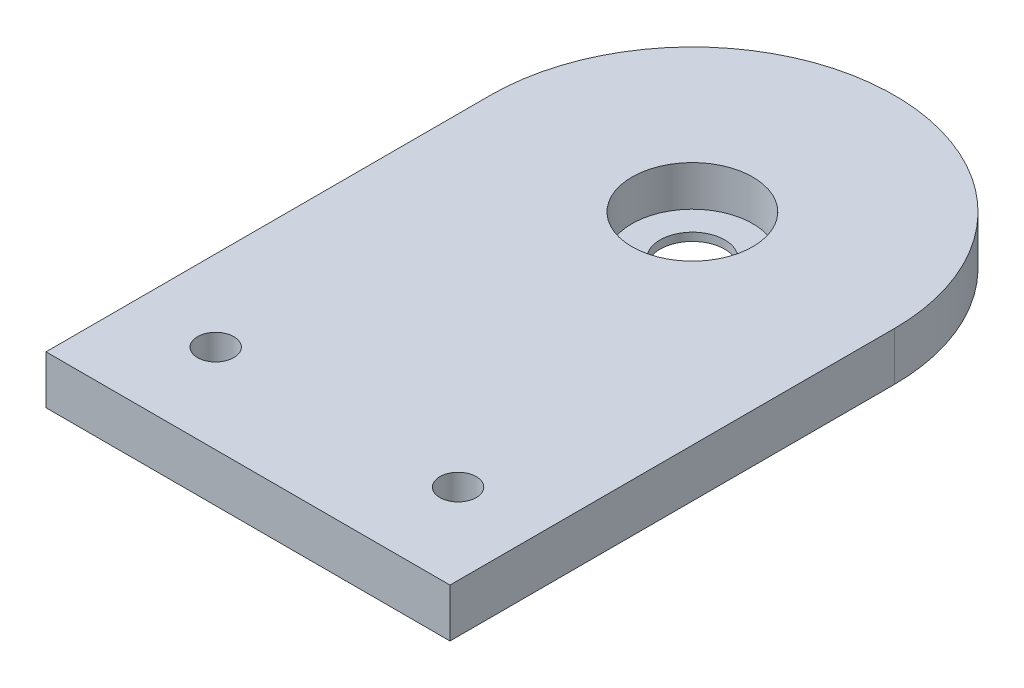
ISO-10303-21;
HEADER;
FILE_DESCRIPTION(('STEP AP214'),'2;1');
FILE_NAME('part.step','',(''),(''),'','','');
FILE_SCHEMA(('AUTOMOTIVE_DESIGN { 1 0 10303 214 1 1 1 1 }'));
ENDSEC;
DATA;
#1=APPLICATION_CONTEXT('core data for automotive mechanical design processes');
#2=APPLICATION_PROTOCOL_DEFINITION('international standard','automotive_design',2000,#1);
#3=PRODUCT_CONTEXT('',#1,'mechanical');
#4=PRODUCT('Part','Part','',(#3));
#5=PRODUCT_RELATED_PRODUCT_CATEGORY('part','',(#4));
#6=PRODUCT_DEFINITION_FORMATION('','',#4);
#7=PRODUCT_DEFINITION_CONTEXT('part definition',#1,'design');
#8=PRODUCT_DEFINITION('design','',#6,#7);
#9=PRODUCT_DEFINITION_SHAPE('','',#8);
#10=(LENGTH_UNIT() NAMED_UNIT(*) SI_UNIT(.MILLI.,.METRE.));
#11=(NAMED_UNIT(*) PLANE_ANGLE_UNIT() SI_UNIT($,.RADIAN.));
#12=(NAMED_UNIT(*) SI_UNIT($,.STERADIAN.) SOLID_ANGLE_UNIT());
#13=UNCERTAINTY_MEASURE_WITH_UNIT(LENGTH_MEASURE(1.E-05),#10,'distance_accuracy_value','');
#14=(GEOMETRIC_REPRESENTATION_CONTEXT(3) GLOBAL_UNCERTAINTY_ASSIGNED_CONTEXT((#13)) GLOBAL_UNIT_ASSIGNED_CONTEXT((#10,
#11,#12)) REPRESENTATION_CONTEXT('',''));
#15=CARTESIAN_POINT('',(0.,0.,0.));
#16=DIRECTION('',(0.,0.,1.));
#17=DIRECTION('',(1.,0.,0.));
#18=AXIS2_PLACEMENT_3D('',#15,#16,#17);
#19=CARTESIAN_POINT('',(25.,-34.5,526.));
#20=DIRECTION('',(-1.,0.,0.));
#21=DIRECTION('',(0.,0.,1.));
#22=AXIS2_PLACEMENT_3D('',#19,#20,#21);
#23=PLANE('',#22);
#24=DIRECTION('',(0.,0.,-1.));
#25=VECTOR('',#24,1.);
#26=CARTESIAN_POINT('',(25.,-40.5,526.));
#27=LINE('',#26,#25);
#28=CARTESIAN_POINT('',(25.,-40.5,545.));
#29=VERTEX_POINT('',#28);
#30=CARTESIAN_POINT('',(25.,-40.5,490.));
#31=VERTEX_POINT('',#30);
#32=EDGE_CURVE('E137',#29,#31,#27,.T.);
#33=ORIENTED_EDGE('',*,*,#32,.T.);
#34=DIRECTION('',(0.,-1.,0.));
#35=VECTOR('',#34,1.);
#36=CARTESIAN_POINT('',(25.,-34.5,490.));
#37=LINE('',#36,#35);
#38=CARTESIAN_POINT('',(25.,-34.5,490.));
#39=VERTEX_POINT('',#38);
#40=EDGE_CURVE('E11',#39,#31,#37,.T.);
#41=ORIENTED_EDGE('',*,*,#40,.F.);
#42=DIRECTION('',(0.,0.,-1.));
#43=VECTOR('',#42,1.);
#44=CARTESIAN_POINT('',(25.,-34.5,526.));
#45=LINE('',#44,#43);
#46=CARTESIAN_POINT('',(25.,-34.5,545.));
#47=VERTEX_POINT('',#46);
#48=EDGE_CURVE('E93',#47,#39,#45,.T.);
#49=ORIENTED_EDGE('',*,*,#48,.F.);
#50=DIRECTION('',(0.,-1.,0.));
#51=VECTOR('',#50,1.);
#52=CARTESIAN_POINT('',(25.,-34.5,545.));
#53=LINE('',#52,#51);
#54=EDGE_CURVE('E103',#47,#29,#53,.T.);
#55=ORIENTED_EDGE('',*,*,#54,.T.);
#56=EDGE_LOOP('',(#33,#41,#49,#55));
#57=FACE_BOUND('',#56,.T.);
#58=ADVANCED_FACE('F43',(#57),#23,.F.);
#59=CARTESIAN_POINT('',(-25.,-34.5,526.));
#60=DIRECTION('',(1.,0.,0.));
#61=DIRECTION('',(0.,0.,-1.));
#62=AXIS2_PLACEMENT_3D('',#59,#60,#61);
#63=PLANE('',#62);
#64=DIRECTION('',(0.,0.,1.));
#65=VECTOR('',#64,1.);
#66=CARTESIAN_POINT('',(-25.,-40.5,526.));
#67=LINE('',#66,#65);
#68=CARTESIAN_POINT('',(-25.,-40.5,490.));
#69=VERTEX_POINT('',#68);
#70=CARTESIAN_POINT('',(-25.,-40.5,545.));
#71=VERTEX_POINT('',#70);
#72=EDGE_CURVE('E100',#69,#71,#67,.T.);
#73=ORIENTED_EDGE('',*,*,#72,.T.);
#74=DIRECTION('',(0.,-1.,0.));
#75=VECTOR('',#74,1.);
#76=CARTESIAN_POINT('',(-25.,-34.5,545.));
#77=LINE('',#76,#75);
#78=CARTESIAN_POINT('',(-25.,-34.5,545.));
#79=VERTEX_POINT('',#78);
#80=EDGE_CURVE('E94',#79,#71,#77,.T.);
#81=ORIENTED_EDGE('',*,*,#80,.F.);
#82=DIRECTION('',(0.,0.,1.));
#83=VECTOR('',#82,1.);
#84=CARTESIAN_POINT('',(-25.,-34.5,526.));
#85=LINE('',#84,#83);
#86=CARTESIAN_POINT('',(-25.,-34.5,490.));
#87=VERTEX_POINT('',#86);
#88=EDGE_CURVE('E81',#87,#79,#85,.T.);
#89=ORIENTED_EDGE('',*,*,#88,.F.);
#90=DIRECTION('',(0.,-1.,0.));
#91=VECTOR('',#90,1.);
#92=CARTESIAN_POINT('',(-25.,-34.5,490.));
#93=LINE('',#92,#91);
#94=EDGE_CURVE('E51',#87,#69,#93,.T.);
#95=ORIENTED_EDGE('',*,*,#94,.T.);
#96=EDGE_LOOP('',(#73,#81,#89,#95));
#97=FACE_BOUND('',#96,.T.);
#98=ADVANCED_FACE('F92',(#97),#63,.F.);
#99=CARTESIAN_POINT('',(0.,-34.5,0.));
#100=DIRECTION('',(0.,-1.,0.));
#101=DIRECTION('',(0.,0.,-1.));
#102=AXIS2_PLACEMENT_3D('',#99,#100,#101);
#103=PLANE('',#102);
#104=CARTESIAN_POINT('',(-15.,-34.5,534.));
#105=DIRECTION('',(0.,1.,0.));
#106=DIRECTION('',(0.,0.,1.));
#107=AXIS2_PLACEMENT_3D('',#104,#105,#106);
#108=CIRCLE('',#107,2.25);
#109=CARTESIAN_POINT('',(-15.,-34.5,536.25));
#110=VERTEX_POINT('',#109);
#111=EDGE_CURVE('E113',#110,#110,#108,.T.);
#112=ORIENTED_EDGE('',*,*,#111,.F.);
#113=EDGE_LOOP('',(#112));
#114=FACE_BOUND('',#113,.T.);
#115=CARTESIAN_POINT('',(15.,-34.5,534.));
#116=DIRECTION('',(0.,1.,0.));
#117=DIRECTION('',(0.,0.,1.));
#118=AXIS2_PLACEMENT_3D('',#115,#116,#117);
#119=CIRCLE('',#118,2.25);
#120=CARTESIAN_POINT('',(15.,-34.5,536.25));
#121=VERTEX_POINT('',#120);
#122=EDGE_CURVE('E119',#121,#121,#119,.T.);
#123=ORIENTED_EDGE('',*,*,#122,.F.);
#124=EDGE_LOOP('',(#123));
#125=FACE_BOUND('',#124,.T.);
#126=CARTESIAN_POINT('',(0.,-34.5,490.));
#127=DIRECTION('',(0.,1.,0.));
#128=DIRECTION('',(0.,0.,1.));
#129=AXIS2_PLACEMENT_3D('',#126,#127,#128);
#130=CIRCLE('',#129,7.475);
#131=CARTESIAN_POINT('',(0.,-34.5,497.475));
#132=VERTEX_POINT('',#131);
#133=EDGE_CURVE('E129',#132,#132,#130,.T.);
#134=ORIENTED_EDGE('',*,*,#133,.F.);
#135=EDGE_LOOP('',(#134));
#136=FACE_BOUND('',#135,.T.);
#137=ORIENTED_EDGE('',*,*,#48,.T.);
#138=CARTESIAN_POINT('',(0.,-34.5,490.));
#139=DIRECTION('',(0.,1.,0.));
#140=DIRECTION('',(0.,0.,1.));
#141=AXIS2_PLACEMENT_3D('',#138,#139,#140);
#142=CIRCLE('',#141,25.);
#143=EDGE_CURVE('E86',#39,#87,#142,.T.);
#144=ORIENTED_EDGE('',*,*,#143,.T.);
#145=ORIENTED_EDGE('',*,*,#88,.T.);
#146=DIRECTION('',(1.,0.,0.));
#147=VECTOR('',#146,1.);
#148=CARTESIAN_POINT('',(-25.,-34.5,545.));
#149=LINE('',#148,#147);
#150=EDGE_CURVE('E88',#79,#47,#149,.T.);
#151=ORIENTED_EDGE('',*,*,#150,.T.);
#152=EDGE_LOOP('',(#137,#144,#145,#151));
#153=FACE_BOUND('',#152,.T.);
#154=ADVANCED_FACE('F83',(#114,#125,#136,#153),#103,.F.);
#155=CARTESIAN_POINT('',(0.,-40.5,0.));
#156=DIRECTION('',(0.,-1.,0.));
#157=DIRECTION('',(0.,0.,-1.));
#158=AXIS2_PLACEMENT_3D('',#155,#156,#157);
#159=PLANE('',#158);
#160=CARTESIAN_POINT('',(-15.,-40.5,534.));
#161=DIRECTION('',(0.,1.,0.));
#162=DIRECTION('',(0.,0.,1.));
#163=AXIS2_PLACEMENT_3D('',#160,#161,#162);
#164=CIRCLE('',#163,2.25);
#165=CARTESIAN_POINT('',(-15.,-40.5,536.25));
#166=VERTEX_POINT('',#165);
#167=EDGE_CURVE('E191',#166,#166,#164,.T.);
#168=ORIENTED_EDGE('',*,*,#167,.T.);
#169=EDGE_LOOP('',(#168));
#170=FACE_BOUND('',#169,.T.);
#171=CARTESIAN_POINT('',(15.,-40.5,534.));
#172=DIRECTION('',(0.,1.,0.));
#173=DIRECTION('',(0.,0.,1.));
#174=AXIS2_PLACEMENT_3D('',#171,#172,#173);
#175=CIRCLE('',#174,2.25);
#176=CARTESIAN_POINT('',(15.,-40.5,536.25));
#177=VERTEX_POINT('',#176);
#178=EDGE_CURVE('E192',#177,#177,#175,.T.);
#179=ORIENTED_EDGE('',*,*,#178,.T.);
#180=EDGE_LOOP('',(#179));
#181=FACE_BOUND('',#180,.T.);
#182=CARTESIAN_POINT('',(0.,-40.5,490.));
#183=DIRECTION('',(0.,1.,0.));
#184=DIRECTION('',(0.,0.,1.));
#185=AXIS2_PLACEMENT_3D('',#182,#183,#184);
#186=CIRCLE('',#185,4.);
#187=CARTESIAN_POINT('',(0.,-40.5,494.));
#188=VERTEX_POINT('',#187);
#189=EDGE_CURVE('E105',#188,#188,#186,.T.);
#190=ORIENTED_EDGE('',*,*,#189,.T.);
#191=EDGE_LOOP('',(#190));
#192=FACE_BOUND('',#191,.T.);
#193=ORIENTED_EDGE('',*,*,#72,.F.);
#194=CARTESIAN_POINT('',(0.,-40.5,490.));
#195=DIRECTION('',(0.,1.,0.));
#196=DIRECTION('',(0.,0.,1.));
#197=AXIS2_PLACEMENT_3D('',#194,#195,#196);
#198=CIRCLE('',#197,25.);
#199=EDGE_CURVE('E60',#31,#69,#198,.T.);
#200=ORIENTED_EDGE('',*,*,#199,.F.);
#201=ORIENTED_EDGE('',*,*,#32,.F.);
#202=DIRECTION('',(1.,0.,0.));
#203=VECTOR('',#202,1.);
#204=CARTESIAN_POINT('',(-25.,-40.5,545.));
#205=LINE('',#204,#203);
#206=EDGE_CURVE('E107',#71,#29,#205,.T.);
#207=ORIENTED_EDGE('',*,*,#206,.F.);
#208=EDGE_LOOP('',(#193,#200,#201,#207));
#209=FACE_BOUND('',#208,.T.);
#210=ADVANCED_FACE('F146',(#170,#181,#192,#209),#159,.T.);
#211=CARTESIAN_POINT('',(0.,-34.5,490.));
#212=DIRECTION('',(0.,-1.,0.));
#213=DIRECTION('',(0.,0.,-1.));
#214=AXIS2_PLACEMENT_3D('',#211,#212,#213);
#215=CYLINDRICAL_SURFACE('',#214,25.);
#216=ORIENTED_EDGE('',*,*,#143,.F.);
#217=ORIENTED_EDGE('',*,*,#40,.T.);
#218=ORIENTED_EDGE('',*,*,#199,.T.);
#219=ORIENTED_EDGE('',*,*,#94,.F.);
#220=EDGE_LOOP('',(#216,#217,#218,#219));
#221=FACE_BOUND('',#220,.T.);
#222=ADVANCED_FACE('F157',(#221),#215,.T.);
#223=CARTESIAN_POINT('',(0.,-34.5,490.));
#224=DIRECTION('',(0.,-1.,0.));
#225=DIRECTION('',(0.,0.,-1.));
#226=AXIS2_PLACEMENT_3D('',#223,#224,#225);
#227=CYLINDRICAL_SURFACE('',#226,7.475);
#228=ORIENTED_EDGE('',*,*,#133,.T.);
#229=EDGE_LOOP('',(#228));
#230=FACE_BOUND('',#229,.T.);
#231=CARTESIAN_POINT('',(0.,-39.5,490.));
#232=DIRECTION('',(0.,1.,0.));
#233=DIRECTION('',(0.,0.,1.));
#234=AXIS2_PLACEMENT_3D('',#231,#232,#233);
#235=CIRCLE('',#234,7.475);
#236=CARTESIAN_POINT('',(0.,-39.5,497.475));
#237=VERTEX_POINT('',#236);
#238=EDGE_CURVE('E124',#237,#237,#235,.T.);
#239=ORIENTED_EDGE('',*,*,#238,.F.);
#240=EDGE_LOOP('',(#239));
#241=FACE_BOUND('',#240,.T.);
#242=ADVANCED_FACE('F163',(#230,#241),#227,.F.);
#243=CARTESIAN_POINT('',(0.,-39.5,490.));
#244=DIRECTION('',(0.,1.,0.));
#245=DIRECTION('',(0.,0.,1.));
#246=AXIS2_PLACEMENT_3D('',#243,#244,#245);
#247=PLANE('',#246);
#248=CARTESIAN_POINT('',(0.,-39.5,490.));
#249=DIRECTION('',(0.,1.,0.));
#250=DIRECTION('',(0.,0.,1.));
#251=AXIS2_PLACEMENT_3D('',#248,#249,#250);
#252=CIRCLE('',#251,4.);
#253=CARTESIAN_POINT('',(0.,-39.5,494.));
#254=VERTEX_POINT('',#253);
#255=EDGE_CURVE('E121',#254,#254,#252,.T.);
#256=ORIENTED_EDGE('',*,*,#255,.F.);
#257=EDGE_LOOP('',(#256));
#258=FACE_BOUND('',#257,.T.);
#259=ORIENTED_EDGE('',*,*,#238,.T.);
#260=EDGE_LOOP('',(#259));
#261=FACE_BOUND('',#260,.T.);
#262=ADVANCED_FACE('F170',(#258,#261),#247,.T.);
#263=CARTESIAN_POINT('',(0.,-39.5,490.));
#264=DIRECTION('',(0.,-1.,0.));
#265=DIRECTION('',(0.,0.,-1.));
#266=AXIS2_PLACEMENT_3D('',#263,#264,#265);
#267=CYLINDRICAL_SURFACE('',#266,4.);
#268=ORIENTED_EDGE('',*,*,#255,.T.);
#269=EDGE_LOOP('',(#268));
#270=FACE_BOUND('',#269,.T.);
#271=ORIENTED_EDGE('',*,*,#189,.F.);
#272=EDGE_LOOP('',(#271));
#273=FACE_BOUND('',#272,.T.);
#274=ADVANCED_FACE('F171',(#270,#273),#267,.F.);
#275=CARTESIAN_POINT('',(-25.,-34.5,545.));
#276=DIRECTION('',(0.,0.,-1.));
#277=DIRECTION('',(-1.,0.,0.));
#278=AXIS2_PLACEMENT_3D('',#275,#276,#277);
#279=PLANE('',#278);
#280=ORIENTED_EDGE('',*,*,#206,.T.);
#281=ORIENTED_EDGE('',*,*,#54,.F.);
#282=ORIENTED_EDGE('',*,*,#150,.F.);
#283=ORIENTED_EDGE('',*,*,#80,.T.);
#284=EDGE_LOOP('',(#280,#281,#282,#283));
#285=FACE_BOUND('',#284,.T.);
#286=ADVANCED_FACE('F104',(#285),#279,.F.);
#287=CARTESIAN_POINT('',(15.,-34.5,534.));
#288=DIRECTION('',(0.,-1.,0.));
#289=DIRECTION('',(0.,0.,-1.));
#290=AXIS2_PLACEMENT_3D('',#287,#288,#289);
#291=CYLINDRICAL_SURFACE('',#290,2.25);
#292=ORIENTED_EDGE('',*,*,#122,.T.);
#293=EDGE_LOOP('',(#292));
#294=FACE_BOUND('',#293,.T.);
#295=ORIENTED_EDGE('',*,*,#178,.F.);
#296=EDGE_LOOP('',(#295));
#297=FACE_BOUND('',#296,.T.);
#298=ADVANCED_FACE('F177',(#294,#297),#291,.F.);
#299=CARTESIAN_POINT('',(-15.,-34.5,534.));
#300=DIRECTION('',(0.,-1.,0.));
#301=DIRECTION('',(0.,0.,-1.));
#302=AXIS2_PLACEMENT_3D('',#299,#300,#301);
#303=CYLINDRICAL_SURFACE('',#302,2.25);
#304=ORIENTED_EDGE('',*,*,#111,.T.);
#305=EDGE_LOOP('',(#304));
#306=FACE_BOUND('',#305,.T.);
#307=ORIENTED_EDGE('',*,*,#167,.F.);
#308=EDGE_LOOP('',(#307));
#309=FACE_BOUND('',#308,.T.);
#310=ADVANCED_FACE('F182',(#306,#309),#303,.F.);
#311=CLOSED_SHELL('',(#58,#98,#154,#210,#222,#242,#262,#274,#286,#298,#310));
#312=MANIFOLD_SOLID_BREP('B2',#311);
#313=ADVANCED_BREP_SHAPE_REPRESENTATION('',(#18,#312),#14);
#314=SHAPE_DEFINITION_REPRESENTATION(#9,#313);
ENDSEC;
END-ISO-10303-21;
